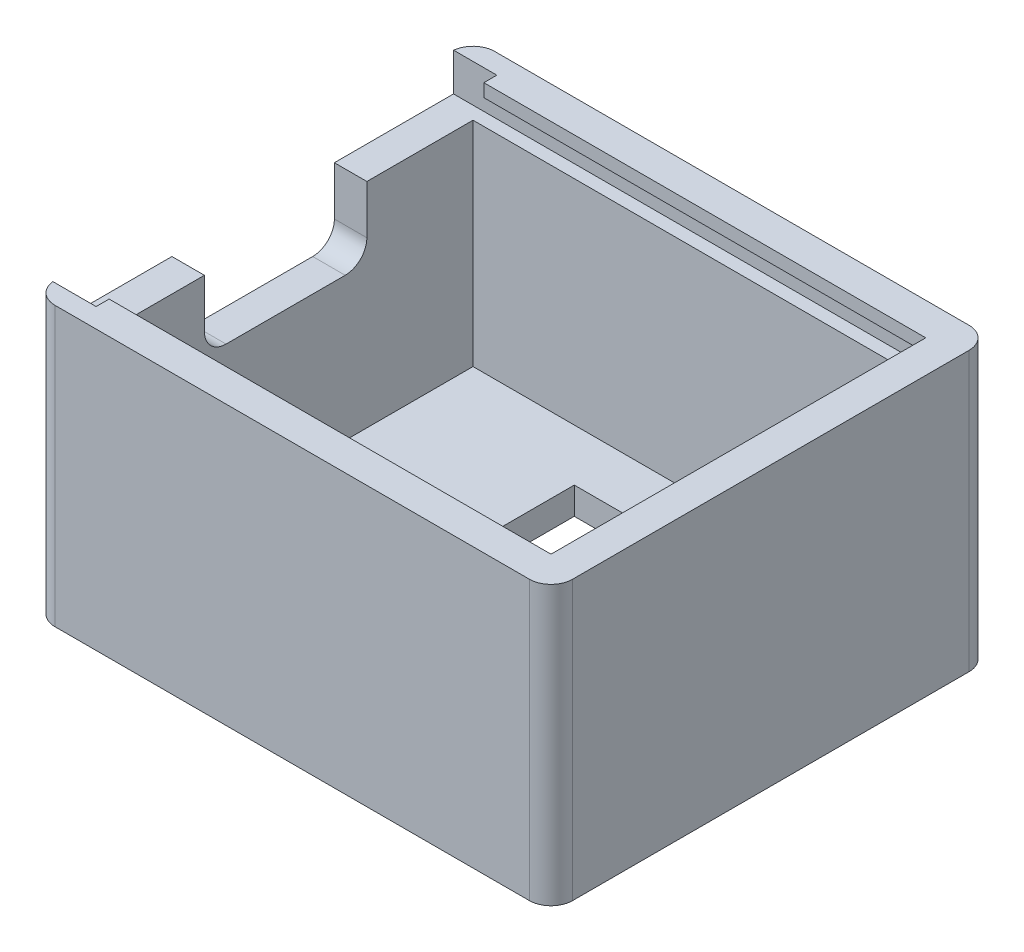
ISO-10303-21;
HEADER;
FILE_DESCRIPTION(('STEP AP214'),'2;1');
FILE_NAME('part.step','',(''),(''),'','','');
FILE_SCHEMA(('AUTOMOTIVE_DESIGN { 1 0 10303 214 1 1 1 1 }'));
ENDSEC;
DATA;
#1=APPLICATION_CONTEXT('core data for automotive mechanical design processes');
#2=APPLICATION_PROTOCOL_DEFINITION('international standard','automotive_design',2000,#1);
#3=PRODUCT_CONTEXT('',#1,'mechanical');
#4=PRODUCT('Part','Part','',(#3));
#5=PRODUCT_RELATED_PRODUCT_CATEGORY('part','',(#4));
#6=PRODUCT_DEFINITION_FORMATION('','',#4);
#7=PRODUCT_DEFINITION_CONTEXT('part definition',#1,'design');
#8=PRODUCT_DEFINITION('design','',#6,#7);
#9=PRODUCT_DEFINITION_SHAPE('','',#8);
#10=(LENGTH_UNIT() NAMED_UNIT(*) SI_UNIT(.MILLI.,.METRE.));
#11=(NAMED_UNIT(*) PLANE_ANGLE_UNIT() SI_UNIT($,.RADIAN.));
#12=(NAMED_UNIT(*) SI_UNIT($,.STERADIAN.) SOLID_ANGLE_UNIT());
#13=UNCERTAINTY_MEASURE_WITH_UNIT(LENGTH_MEASURE(1.E-05),#10,'distance_accuracy_value','');
#14=(GEOMETRIC_REPRESENTATION_CONTEXT(3) GLOBAL_UNCERTAINTY_ASSIGNED_CONTEXT((#13)) GLOBAL_UNIT_ASSIGNED_CONTEXT((#10,
#11,#12)) REPRESENTATION_CONTEXT('',''));
#15=CARTESIAN_POINT('',(0.,0.,0.));
#16=DIRECTION('',(0.,0.,1.));
#17=DIRECTION('',(1.,0.,0.));
#18=AXIS2_PLACEMENT_3D('',#15,#16,#17);
#19=CARTESIAN_POINT('',(-20.9,2.5,17.3));
#20=DIRECTION('',(0.,0.,1.));
#21=DIRECTION('',(1.,0.,0.));
#22=AXIS2_PLACEMENT_3D('',#19,#20,#21);
#23=PLANE('',#22);
#24=DIRECTION('',(0.,-1.,0.));
#25=VECTOR('',#24,1.);
#26=CARTESIAN_POINT('',(-19.9,2.5,17.3));
#27=LINE('',#26,#25);
#28=CARTESIAN_POINT('',(-19.9,25.7,17.3));
#29=VERTEX_POINT('',#28);
#30=CARTESIAN_POINT('',(-19.9,24.5,17.3));
#31=VERTEX_POINT('',#30);
#32=EDGE_CURVE('E468',#29,#31,#27,.T.);
#33=ORIENTED_EDGE('',*,*,#32,.F.);
#34=DIRECTION('',(1.,0.,0.));
#35=VECTOR('',#34,1.);
#36=CARTESIAN_POINT('',(-20.9,25.7,17.3));
#37=LINE('',#36,#35);
#38=CARTESIAN_POINT('',(20.9,25.7,17.3));
#39=VERTEX_POINT('',#38);
#40=EDGE_CURVE('E339',#29,#39,#37,.T.);
#41=ORIENTED_EDGE('',*,*,#40,.T.);
#42=DIRECTION('',(0.,1.,0.));
#43=VECTOR('',#42,1.);
#44=CARTESIAN_POINT('',(20.9,2.5,17.3));
#45=LINE('',#44,#43);
#46=CARTESIAN_POINT('',(20.9,24.5,17.3));
#47=VERTEX_POINT('',#46);
#48=EDGE_CURVE('E359',#47,#39,#45,.T.);
#49=ORIENTED_EDGE('',*,*,#48,.F.);
#50=DIRECTION('',(-1.,0.,0.));
#51=VECTOR('',#50,1.);
#52=CARTESIAN_POINT('',(-20.9,24.5,17.3));
#53=LINE('',#52,#51);
#54=EDGE_CURVE('E296',#47,#31,#53,.T.);
#55=ORIENTED_EDGE('',*,*,#54,.T.);
#56=EDGE_LOOP('',(#33,#41,#49,#55));
#57=FACE_BOUND('',#56,.T.);
#58=ADVANCED_FACE('F39',(#57),#23,.F.);
#59=CARTESIAN_POINT('',(-20.9,2.5,-17.3));
#60=DIRECTION('',(0.,0.,-1.));
#61=DIRECTION('',(-1.,0.,0.));
#62=AXIS2_PLACEMENT_3D('',#59,#60,#61);
#63=PLANE('',#62);
#64=DIRECTION('',(0.,1.,0.));
#65=VECTOR('',#64,1.);
#66=CARTESIAN_POINT('',(-19.9,2.5,-17.3));
#67=LINE('',#66,#65);
#68=CARTESIAN_POINT('',(-19.9,24.5,-17.3));
#69=VERTEX_POINT('',#68);
#70=CARTESIAN_POINT('',(-19.9,25.7,-17.3));
#71=VERTEX_POINT('',#70);
#72=EDGE_CURVE('E475',#69,#71,#67,.T.);
#73=ORIENTED_EDGE('',*,*,#72,.F.);
#74=DIRECTION('',(1.,0.,0.));
#75=VECTOR('',#74,1.);
#76=CARTESIAN_POINT('',(-20.9,24.5,-17.3));
#77=LINE('',#76,#75);
#78=CARTESIAN_POINT('',(20.9,24.5,-17.3));
#79=VERTEX_POINT('',#78);
#80=EDGE_CURVE('E294',#69,#79,#77,.T.);
#81=ORIENTED_EDGE('',*,*,#80,.T.);
#82=DIRECTION('',(0.,1.,0.));
#83=VECTOR('',#82,1.);
#84=CARTESIAN_POINT('',(20.9,2.5,-17.3));
#85=LINE('',#84,#83);
#86=CARTESIAN_POINT('',(20.9,25.7,-17.3));
#87=VERTEX_POINT('',#86);
#88=EDGE_CURVE('E348',#79,#87,#85,.T.);
#89=ORIENTED_EDGE('',*,*,#88,.T.);
#90=DIRECTION('',(-1.,0.,0.));
#91=VECTOR('',#90,1.);
#92=CARTESIAN_POINT('',(-20.9,25.7,-17.3));
#93=LINE('',#92,#91);
#94=EDGE_CURVE('E351',#87,#71,#93,.T.);
#95=ORIENTED_EDGE('',*,*,#94,.T.);
#96=EDGE_LOOP('',(#73,#81,#89,#95));
#97=FACE_BOUND('',#96,.T.);
#98=ADVANCED_FACE('F552',(#97),#63,.F.);
#99=CARTESIAN_POINT('',(0.,24.5,0.));
#100=DIRECTION('',(0.,1.,0.));
#101=DIRECTION('',(0.,0.,1.));
#102=AXIS2_PLACEMENT_3D('',#99,#100,#101);
#103=PLANE('',#102);
#104=DIRECTION('',(0.,0.,1.));
#105=VECTOR('',#104,1.);
#106=CARTESIAN_POINT('',(-19.9,24.5,0.));
#107=LINE('',#106,#105);
#108=CARTESIAN_POINT('',(-19.9,24.5,-18.5));
#109=VERTEX_POINT('',#108);
#110=EDGE_CURVE('E469',#109,#69,#107,.T.);
#111=ORIENTED_EDGE('',*,*,#110,.F.);
#112=DIRECTION('',(-1.,0.,0.));
#113=VECTOR('',#112,1.);
#114=CARTESIAN_POINT('',(-24.9,24.5,-18.5));
#115=LINE('',#114,#113);
#116=CARTESIAN_POINT('',(22.1,24.5,-18.5));
#117=VERTEX_POINT('',#116);
#118=EDGE_CURVE('E488',#117,#109,#115,.T.);
#119=ORIENTED_EDGE('',*,*,#118,.F.);
#120=DIRECTION('',(0.,0.,-1.));
#121=VECTOR('',#120,1.);
#122=CARTESIAN_POINT('',(22.1,24.5,-18.5));
#123=LINE('',#122,#121);
#124=CARTESIAN_POINT('',(22.1,24.5,18.5));
#125=VERTEX_POINT('',#124);
#126=EDGE_CURVE('E485',#125,#117,#123,.T.);
#127=ORIENTED_EDGE('',*,*,#126,.F.);
#128=DIRECTION('',(1.,0.,0.));
#129=VECTOR('',#128,1.);
#130=CARTESIAN_POINT('',(-24.9,24.5,18.5));
#131=LINE('',#130,#129);
#132=CARTESIAN_POINT('',(-19.9,24.5,18.5));
#133=VERTEX_POINT('',#132);
#134=EDGE_CURVE('E483',#133,#125,#131,.T.);
#135=ORIENTED_EDGE('',*,*,#134,.F.);
#136=EDGE_CURVE('E466',#31,#133,#107,.T.);
#137=ORIENTED_EDGE('',*,*,#136,.F.);
#138=ORIENTED_EDGE('',*,*,#54,.F.);
#139=DIRECTION('',(0.,0.,1.));
#140=VECTOR('',#139,1.);
#141=CARTESIAN_POINT('',(20.9,24.5,-17.3));
#142=LINE('',#141,#140);
#143=EDGE_CURVE('E299',#79,#47,#142,.T.);
#144=ORIENTED_EDGE('',*,*,#143,.F.);
#145=ORIENTED_EDGE('',*,*,#80,.F.);
#146=EDGE_LOOP('',(#111,#119,#127,#135,#137,#138,#144,#145));
#147=FACE_BOUND('',#146,.T.);
#148=ADVANCED_FACE('F558',(#147),#103,.F.);
#149=CARTESIAN_POINT('',(-23.9,25.7,-20.3));
#150=DIRECTION('',(1.,0.,0.));
#151=DIRECTION('',(0.,0.,-1.));
#152=AXIS2_PLACEMENT_3D('',#149,#150,#151);
#153=PLANE('',#152);
#154=DIRECTION('',(0.,0.,1.));
#155=VECTOR('',#154,1.);
#156=CARTESIAN_POINT('',(-23.9,22.2,-20.3));
#157=LINE('',#156,#155);
#158=CARTESIAN_POINT('',(-23.9,22.2,7.5));
#159=VERTEX_POINT('',#158);
#160=CARTESIAN_POINT('',(-23.9,22.2,18.3));
#161=VERTEX_POINT('',#160);
#162=EDGE_CURVE('E262',#159,#161,#157,.T.);
#163=ORIENTED_EDGE('',*,*,#162,.F.);
#164=DIRECTION('',(0.,1.,0.));
#165=VECTOR('',#164,1.);
#166=CARTESIAN_POINT('',(-23.9,28.7,7.5));
#167=LINE('',#166,#165);
#168=CARTESIAN_POINT('',(-23.9,17.7,7.5));
#169=VERTEX_POINT('',#168);
#170=EDGE_CURVE('E248',#169,#159,#167,.T.);
#171=ORIENTED_EDGE('',*,*,#170,.F.);
#172=CARTESIAN_POINT('',(-23.9,17.7,5.5));
#173=DIRECTION('',(1.,0.,0.));
#174=DIRECTION('',(0.,0.,-1.));
#175=AXIS2_PLACEMENT_3D('',#172,#173,#174);
#176=CIRCLE('',#175,2.);
#177=CARTESIAN_POINT('',(-23.9,15.7,5.5));
#178=VERTEX_POINT('',#177);
#179=EDGE_CURVE('E439',#169,#178,#176,.T.);
#180=ORIENTED_EDGE('',*,*,#179,.T.);
#181=DIRECTION('',(0.,0.,1.));
#182=VECTOR('',#181,1.);
#183=CARTESIAN_POINT('',(-23.9,15.7,-7.5));
#184=LINE('',#183,#182);
#185=CARTESIAN_POINT('',(-23.9,15.7,-5.5));
#186=VERTEX_POINT('',#185);
#187=EDGE_CURVE('E454',#186,#178,#184,.T.);
#188=ORIENTED_EDGE('',*,*,#187,.F.);
#189=CARTESIAN_POINT('',(-23.9,17.7,-5.5));
#190=DIRECTION('',(1.,0.,0.));
#191=DIRECTION('',(0.,0.,-1.));
#192=AXIS2_PLACEMENT_3D('',#189,#190,#191);
#193=CIRCLE('',#192,2.);
#194=CARTESIAN_POINT('',(-23.9,17.7,-7.5));
#195=VERTEX_POINT('',#194);
#196=EDGE_CURVE('E47',#186,#195,#193,.T.);
#197=ORIENTED_EDGE('',*,*,#196,.T.);
#198=DIRECTION('',(0.,-1.,0.));
#199=VECTOR('',#198,1.);
#200=CARTESIAN_POINT('',(-23.9,28.7,-7.5));
#201=LINE('',#200,#199);
#202=CARTESIAN_POINT('',(-23.9,22.2,-7.5));
#203=VERTEX_POINT('',#202);
#204=EDGE_CURVE('E257',#203,#195,#201,.T.);
#205=ORIENTED_EDGE('',*,*,#204,.F.);
#206=CARTESIAN_POINT('',(-23.9,22.2,-18.3));
#207=VERTEX_POINT('',#206);
#208=EDGE_CURVE('E274',#207,#203,#157,.T.);
#209=ORIENTED_EDGE('',*,*,#208,.F.);
#210=DIRECTION('',(0.,-1.,0.));
#211=VECTOR('',#210,1.);
#212=CARTESIAN_POINT('',(-23.9,25.7,-18.3));
#213=LINE('',#212,#211);
#214=CARTESIAN_POINT('',(-23.9,0.,-18.3));
#215=VERTEX_POINT('',#214);
#216=EDGE_CURVE('E416',#207,#215,#213,.T.);
#217=ORIENTED_EDGE('',*,*,#216,.T.);
#218=DIRECTION('',(0.,0.,1.));
#219=VECTOR('',#218,1.);
#220=CARTESIAN_POINT('',(-23.9,0.,-20.3));
#221=LINE('',#220,#219);
#222=CARTESIAN_POINT('',(-23.9,0.,18.3));
#223=VERTEX_POINT('',#222);
#224=EDGE_CURVE('E385',#215,#223,#221,.T.);
#225=ORIENTED_EDGE('',*,*,#224,.T.);
#226=DIRECTION('',(0.,-1.,0.));
#227=VECTOR('',#226,1.);
#228=CARTESIAN_POINT('',(-23.9,25.7,18.3));
#229=LINE('',#228,#227);
#230=EDGE_CURVE('E273',#223,#161,#229,.F.);
#231=ORIENTED_EDGE('',*,*,#230,.T.);
#232=EDGE_LOOP('',(#163,#171,#180,#188,#197,#205,#209,#217,#225,#231));
#233=FACE_BOUND('',#232,.T.);
#234=ADVANCED_FACE('F270',(#233),#153,.F.);
#235=CARTESIAN_POINT('',(20.9,2.5,-17.3));
#236=DIRECTION('',(1.,0.,0.));
#237=DIRECTION('',(0.,0.,-1.));
#238=AXIS2_PLACEMENT_3D('',#235,#236,#237);
#239=PLANE('',#238);
#240=DIRECTION('',(0.,0.,1.));
#241=VECTOR('',#240,1.);
#242=CARTESIAN_POINT('',(20.9,22.2,-17.3));
#243=LINE('',#242,#241);
#244=CARTESIAN_POINT('',(20.9,22.2,-17.3));
#245=VERTEX_POINT('',#244);
#246=CARTESIAN_POINT('',(20.9,22.2,17.3));
#247=VERTEX_POINT('',#246);
#248=EDGE_CURVE('E292',#245,#247,#243,.T.);
#249=ORIENTED_EDGE('',*,*,#248,.F.);
#250=CARTESIAN_POINT('',(20.9,2.5,-17.3));
#251=VERTEX_POINT('',#250);
#252=EDGE_CURVE('E366',#251,#245,#85,.T.);
#253=ORIENTED_EDGE('',*,*,#252,.F.);
#254=DIRECTION('',(0.,0.,-1.));
#255=VECTOR('',#254,1.);
#256=CARTESIAN_POINT('',(20.9,2.5,-17.3));
#257=LINE('',#256,#255);
#258=CARTESIAN_POINT('',(20.9,2.5,17.3));
#259=VERTEX_POINT('',#258);
#260=EDGE_CURVE('E335',#259,#251,#257,.T.);
#261=ORIENTED_EDGE('',*,*,#260,.F.);
#262=EDGE_CURVE('E355',#259,#247,#45,.T.);
#263=ORIENTED_EDGE('',*,*,#262,.T.);
#264=EDGE_LOOP('',(#249,#253,#261,#263));
#265=FACE_BOUND('',#264,.T.);
#266=ADVANCED_FACE('F525',(#265),#239,.F.);
#267=DIRECTION('',(-1.,0.,0.));
#268=VECTOR('',#267,1.);
#269=CARTESIAN_POINT('',(-20.9,22.2,17.3));
#270=LINE('',#269,#268);
#271=CARTESIAN_POINT('',(-20.9,22.2,17.3));
#272=VERTEX_POINT('',#271);
#273=EDGE_CURVE('E290',#247,#272,#270,.T.);
#274=ORIENTED_EDGE('',*,*,#273,.F.);
#275=ORIENTED_EDGE('',*,*,#262,.F.);
#276=DIRECTION('',(1.,0.,0.));
#277=VECTOR('',#276,1.);
#278=CARTESIAN_POINT('',(-20.9,2.5,17.3));
#279=LINE('',#278,#277);
#280=CARTESIAN_POINT('',(-20.9,2.5,17.3));
#281=VERTEX_POINT('',#280);
#282=EDGE_CURVE('E345',#281,#259,#279,.T.);
#283=ORIENTED_EDGE('',*,*,#282,.F.);
#284=DIRECTION('',(0.,1.,0.));
#285=VECTOR('',#284,1.);
#286=CARTESIAN_POINT('',(-20.9,2.5,17.3));
#287=LINE('',#286,#285);
#288=EDGE_CURVE('E360',#281,#272,#287,.T.);
#289=ORIENTED_EDGE('',*,*,#288,.T.);
#290=EDGE_LOOP('',(#274,#275,#283,#289));
#291=FACE_BOUND('',#290,.T.);
#292=ADVANCED_FACE('F529',(#291),#23,.F.);
#293=CARTESIAN_POINT('',(-20.9,2.5,-17.3));
#294=DIRECTION('',(-1.,0.,0.));
#295=DIRECTION('',(0.,0.,1.));
#296=AXIS2_PLACEMENT_3D('',#293,#294,#295);
#297=PLANE('',#296);
#298=DIRECTION('',(0.,-1.,0.));
#299=VECTOR('',#298,1.);
#300=CARTESIAN_POINT('',(-20.9,2.5,-7.5));
#301=LINE('',#300,#299);
#302=CARTESIAN_POINT('',(-20.9,22.2,-7.5));
#303=VERTEX_POINT('',#302);
#304=CARTESIAN_POINT('',(-20.9,17.7,-7.5));
#305=VERTEX_POINT('',#304);
#306=EDGE_CURVE('E450',#303,#305,#301,.T.);
#307=ORIENTED_EDGE('',*,*,#306,.T.);
#308=CARTESIAN_POINT('',(-20.9,17.7,-5.5));
#309=DIRECTION('',(-1.,0.,0.));
#310=DIRECTION('',(0.,0.,1.));
#311=AXIS2_PLACEMENT_3D('',#308,#309,#310);
#312=CIRCLE('',#311,2.);
#313=CARTESIAN_POINT('',(-20.9,15.7,-5.5));
#314=VERTEX_POINT('',#313);
#315=EDGE_CURVE('E11',#305,#314,#312,.T.);
#316=ORIENTED_EDGE('',*,*,#315,.T.);
#317=DIRECTION('',(0.,0.,1.));
#318=VECTOR('',#317,1.);
#319=CARTESIAN_POINT('',(-20.9,15.7,-17.3));
#320=LINE('',#319,#318);
#321=CARTESIAN_POINT('',(-20.9,15.7,5.5));
#322=VERTEX_POINT('',#321);
#323=EDGE_CURVE('E266',#314,#322,#320,.T.);
#324=ORIENTED_EDGE('',*,*,#323,.T.);
#325=CARTESIAN_POINT('',(-20.9,17.7,5.5));
#326=DIRECTION('',(-1.,0.,0.));
#327=DIRECTION('',(0.,0.,1.));
#328=AXIS2_PLACEMENT_3D('',#325,#326,#327);
#329=CIRCLE('',#328,2.);
#330=CARTESIAN_POINT('',(-20.9,17.7,7.5));
#331=VERTEX_POINT('',#330);
#332=EDGE_CURVE('E441',#322,#331,#329,.T.);
#333=ORIENTED_EDGE('',*,*,#332,.T.);
#334=DIRECTION('',(0.,1.,0.));
#335=VECTOR('',#334,1.);
#336=CARTESIAN_POINT('',(-20.9,2.50000000000001,7.5));
#337=LINE('',#336,#335);
#338=CARTESIAN_POINT('',(-20.9,22.2,7.5));
#339=VERTEX_POINT('',#338);
#340=EDGE_CURVE('E445',#331,#339,#337,.T.);
#341=ORIENTED_EDGE('',*,*,#340,.T.);
#342=DIRECTION('',(0.,0.,-1.));
#343=VECTOR('',#342,1.);
#344=CARTESIAN_POINT('',(-20.9,22.2,-17.3));
#345=LINE('',#344,#343);
#346=EDGE_CURVE('E265',#272,#339,#345,.T.);
#347=ORIENTED_EDGE('',*,*,#346,.F.);
#348=ORIENTED_EDGE('',*,*,#288,.F.);
#349=DIRECTION('',(0.,0.,1.));
#350=VECTOR('',#349,1.);
#351=CARTESIAN_POINT('',(-20.9,2.5,-17.3));
#352=LINE('',#351,#350);
#353=CARTESIAN_POINT('',(-20.9,2.5,-17.3));
#354=VERTEX_POINT('',#353);
#355=EDGE_CURVE('E342',#354,#281,#352,.T.);
#356=ORIENTED_EDGE('',*,*,#355,.F.);
#357=DIRECTION('',(0.,1.,0.));
#358=VECTOR('',#357,1.);
#359=CARTESIAN_POINT('',(-20.9,2.5,-17.3));
#360=LINE('',#359,#358);
#361=CARTESIAN_POINT('',(-20.9,22.2,-17.3));
#362=VERTEX_POINT('',#361);
#363=EDGE_CURVE('E363',#354,#362,#360,.T.);
#364=ORIENTED_EDGE('',*,*,#363,.T.);
#365=EDGE_CURVE('E288',#303,#362,#345,.T.);
#366=ORIENTED_EDGE('',*,*,#365,.F.);
#367=EDGE_LOOP('',(#307,#316,#324,#333,#341,#347,#348,#356,#364,#366));
#368=FACE_BOUND('',#367,.T.);
#369=ADVANCED_FACE('F444',(#368),#297,.F.);
#370=DIRECTION('',(1.,0.,0.));
#371=VECTOR('',#370,1.);
#372=CARTESIAN_POINT('',(-20.9,22.2,-17.3));
#373=LINE('',#372,#371);
#374=EDGE_CURVE('E286',#362,#245,#373,.T.);
#375=ORIENTED_EDGE('',*,*,#374,.F.);
#376=ORIENTED_EDGE('',*,*,#363,.F.);
#377=DIRECTION('',(-1.,0.,0.));
#378=VECTOR('',#377,1.);
#379=CARTESIAN_POINT('',(-20.9,2.5,-17.3));
#380=LINE('',#379,#378);
#381=EDGE_CURVE('E338',#251,#354,#380,.T.);
#382=ORIENTED_EDGE('',*,*,#381,.F.);
#383=ORIENTED_EDGE('',*,*,#252,.T.);
#384=EDGE_LOOP('',(#375,#376,#382,#383));
#385=FACE_BOUND('',#384,.T.);
#386=ADVANCED_FACE('F521',(#385),#63,.F.);
#387=CARTESIAN_POINT('',(23.9,25.7,-20.3));
#388=DIRECTION('',(-1.,0.,0.));
#389=DIRECTION('',(0.,0.,1.));
#390=AXIS2_PLACEMENT_3D('',#387,#388,#389);
#391=PLANE('',#390);
#392=DIRECTION('',(0.,0.,-1.));
#393=VECTOR('',#392,1.);
#394=CARTESIAN_POINT('',(23.9,0.,-20.3));
#395=LINE('',#394,#393);
#396=CARTESIAN_POINT('',(23.9,0.,18.3));
#397=VERTEX_POINT('',#396);
#398=CARTESIAN_POINT('',(23.9,0.,-18.3));
#399=VERTEX_POINT('',#398);
#400=EDGE_CURVE('E358',#397,#399,#395,.T.);
#401=ORIENTED_EDGE('',*,*,#400,.T.);
#402=DIRECTION('',(0.,-1.,0.));
#403=VECTOR('',#402,1.);
#404=CARTESIAN_POINT('',(23.9,25.7,-18.3));
#405=LINE('',#404,#403);
#406=CARTESIAN_POINT('',(23.9,25.7,-18.3));
#407=VERTEX_POINT('',#406);
#408=EDGE_CURVE('E404',#399,#407,#405,.F.);
#409=ORIENTED_EDGE('',*,*,#408,.T.);
#410=DIRECTION('',(0.,0.,-1.));
#411=VECTOR('',#410,1.);
#412=CARTESIAN_POINT('',(23.9,25.7,-20.3));
#413=LINE('',#412,#411);
#414=CARTESIAN_POINT('',(23.9,25.7,18.3));
#415=VERTEX_POINT('',#414);
#416=EDGE_CURVE('E369',#415,#407,#413,.T.);
#417=ORIENTED_EDGE('',*,*,#416,.F.);
#418=DIRECTION('',(0.,-1.,0.));
#419=VECTOR('',#418,1.);
#420=CARTESIAN_POINT('',(23.9,25.7,18.3));
#421=LINE('',#420,#419);
#422=EDGE_CURVE('E401',#415,#397,#421,.T.);
#423=ORIENTED_EDGE('',*,*,#422,.T.);
#424=EDGE_LOOP('',(#401,#409,#417,#423));
#425=FACE_BOUND('',#424,.T.);
#426=ADVANCED_FACE('F588',(#425),#391,.F.);
#427=CARTESIAN_POINT('',(-23.9,25.7,-20.3));
#428=DIRECTION('',(0.,0.,1.));
#429=DIRECTION('',(1.,0.,0.));
#430=AXIS2_PLACEMENT_3D('',#427,#428,#429);
#431=PLANE('',#430);
#432=DIRECTION('',(-1.,0.,0.));
#433=VECTOR('',#432,1.);
#434=CARTESIAN_POINT('',(-23.9,25.7,-20.3));
#435=LINE('',#434,#433);
#436=CARTESIAN_POINT('',(21.9,25.7,-20.3));
#437=VERTEX_POINT('',#436);
#438=CARTESIAN_POINT('',(-21.9,25.7,-20.3));
#439=VERTEX_POINT('',#438);
#440=EDGE_CURVE('E372',#437,#439,#435,.T.);
#441=ORIENTED_EDGE('',*,*,#440,.F.);
#442=DIRECTION('',(0.,-1.,0.));
#443=VECTOR('',#442,1.);
#444=CARTESIAN_POINT('',(21.9,25.7,-20.3));
#445=LINE('',#444,#443);
#446=CARTESIAN_POINT('',(21.9,0.,-20.3));
#447=VERTEX_POINT('',#446);
#448=EDGE_CURVE('E390',#437,#447,#445,.T.);
#449=ORIENTED_EDGE('',*,*,#448,.T.);
#450=DIRECTION('',(-1.,0.,0.));
#451=VECTOR('',#450,1.);
#452=CARTESIAN_POINT('',(-23.9,0.,-20.3));
#453=LINE('',#452,#451);
#454=CARTESIAN_POINT('',(-21.9,0.,-20.3));
#455=VERTEX_POINT('',#454);
#456=EDGE_CURVE('E382',#447,#455,#453,.T.);
#457=ORIENTED_EDGE('',*,*,#456,.T.);
#458=DIRECTION('',(0.,-1.,0.));
#459=VECTOR('',#458,1.);
#460=CARTESIAN_POINT('',(-21.9,25.7,-20.3));
#461=LINE('',#460,#459);
#462=EDGE_CURVE('E379',#455,#439,#461,.F.);
#463=ORIENTED_EDGE('',*,*,#462,.T.);
#464=EDGE_LOOP('',(#441,#449,#457,#463));
#465=FACE_BOUND('',#464,.T.);
#466=ADVANCED_FACE('F583',(#465),#431,.F.);
#467=CARTESIAN_POINT('',(-23.9,25.7,20.3));
#468=DIRECTION('',(0.,0.,-1.));
#469=DIRECTION('',(-1.,0.,0.));
#470=AXIS2_PLACEMENT_3D('',#467,#468,#469);
#471=PLANE('',#470);
#472=DIRECTION('',(1.,0.,0.));
#473=VECTOR('',#472,1.);
#474=CARTESIAN_POINT('',(-23.9,25.7,20.3));
#475=LINE('',#474,#473);
#476=CARTESIAN_POINT('',(-21.9,25.7,20.3));
#477=VERTEX_POINT('',#476);
#478=CARTESIAN_POINT('',(21.9,25.7,20.3));
#479=VERTEX_POINT('',#478);
#480=EDGE_CURVE('E376',#477,#479,#475,.T.);
#481=ORIENTED_EDGE('',*,*,#480,.F.);
#482=DIRECTION('',(0.,-1.,0.));
#483=VECTOR('',#482,1.);
#484=CARTESIAN_POINT('',(-21.9,25.7,20.3));
#485=LINE('',#484,#483);
#486=CARTESIAN_POINT('',(-21.9,0.,20.3));
#487=VERTEX_POINT('',#486);
#488=EDGE_CURVE('E420',#477,#487,#485,.T.);
#489=ORIENTED_EDGE('',*,*,#488,.T.);
#490=DIRECTION('',(1.,0.,0.));
#491=VECTOR('',#490,1.);
#492=CARTESIAN_POINT('',(-23.9,0.,20.3));
#493=LINE('',#492,#491);
#494=CARTESIAN_POINT('',(21.9,0.,20.3));
#495=VERTEX_POINT('',#494);
#496=EDGE_CURVE('E373',#487,#495,#493,.T.);
#497=ORIENTED_EDGE('',*,*,#496,.T.);
#498=DIRECTION('',(0.,-1.,0.));
#499=VECTOR('',#498,1.);
#500=CARTESIAN_POINT('',(21.9,25.7,20.3));
#501=LINE('',#500,#499);
#502=EDGE_CURVE('E418',#495,#479,#501,.F.);
#503=ORIENTED_EDGE('',*,*,#502,.T.);
#504=EDGE_LOOP('',(#481,#489,#497,#503));
#505=FACE_BOUND('',#504,.T.);
#506=ADVANCED_FACE('F578',(#505),#471,.F.);
#507=CARTESIAN_POINT('',(0.,25.7,0.));
#508=DIRECTION('',(0.,1.,0.));
#509=DIRECTION('',(0.,0.,1.));
#510=AXIS2_PLACEMENT_3D('',#507,#508,#509);
#511=PLANE('',#510);
#512=DIRECTION('',(-1.,0.,0.));
#513=VECTOR('',#512,1.);
#514=CARTESIAN_POINT('',(0.,25.7,-18.5));
#515=LINE('',#514,#513);
#516=CARTESIAN_POINT('',(-19.9,25.7,-18.5));
#517=VERTEX_POINT('',#516);
#518=CARTESIAN_POINT('',(-23.8899748742132,25.7,-18.5));
#519=VERTEX_POINT('',#518);
#520=EDGE_CURVE('E477',#517,#519,#515,.T.);
#521=ORIENTED_EDGE('',*,*,#520,.F.);
#522=DIRECTION('',(0.,0.,1.));
#523=VECTOR('',#522,1.);
#524=CARTESIAN_POINT('',(-19.9,25.7,0.));
#525=LINE('',#524,#523);
#526=EDGE_CURVE('E474',#517,#71,#525,.T.);
#527=ORIENTED_EDGE('',*,*,#526,.T.);
#528=ORIENTED_EDGE('',*,*,#94,.F.);
#529=DIRECTION('',(0.,0.,-1.));
#530=VECTOR('',#529,1.);
#531=CARTESIAN_POINT('',(20.9,25.7,-17.3));
#532=LINE('',#531,#530);
#533=EDGE_CURVE('E328',#39,#87,#532,.T.);
#534=ORIENTED_EDGE('',*,*,#533,.F.);
#535=ORIENTED_EDGE('',*,*,#40,.F.);
#536=CARTESIAN_POINT('',(-19.9,25.7,18.5));
#537=VERTEX_POINT('',#536);
#538=EDGE_CURVE('E471',#29,#537,#525,.T.);
#539=ORIENTED_EDGE('',*,*,#538,.T.);
#540=DIRECTION('',(1.,0.,0.));
#541=VECTOR('',#540,1.);
#542=CARTESIAN_POINT('',(0.,25.7,18.5));
#543=LINE('',#542,#541);
#544=CARTESIAN_POINT('',(-23.8899748742132,25.7,18.5));
#545=VERTEX_POINT('',#544);
#546=EDGE_CURVE('E480',#545,#537,#543,.T.);
#547=ORIENTED_EDGE('',*,*,#546,.F.);
#548=CARTESIAN_POINT('',(-21.9,25.7,18.3));
#549=DIRECTION('',(0.,1.,0.));
#550=DIRECTION('',(0.,0.,1.));
#551=AXIS2_PLACEMENT_3D('',#548,#549,#550);
#552=CIRCLE('',#551,2.);
#553=EDGE_CURVE('E408',#545,#477,#552,.T.);
#554=ORIENTED_EDGE('',*,*,#553,.T.);
#555=ORIENTED_EDGE('',*,*,#480,.T.);
#556=CARTESIAN_POINT('',(21.9,25.7,18.3));
#557=DIRECTION('',(0.,1.,0.));
#558=DIRECTION('',(0.,0.,1.));
#559=AXIS2_PLACEMENT_3D('',#556,#557,#558);
#560=CIRCLE('',#559,2.);
#561=EDGE_CURVE('E406',#479,#415,#560,.T.);
#562=ORIENTED_EDGE('',*,*,#561,.T.);
#563=ORIENTED_EDGE('',*,*,#416,.T.);
#564=CARTESIAN_POINT('',(21.9,25.7,-18.3));
#565=DIRECTION('',(0.,1.,0.));
#566=DIRECTION('',(0.,0.,1.));
#567=AXIS2_PLACEMENT_3D('',#564,#565,#566);
#568=CIRCLE('',#567,2.);
#569=EDGE_CURVE('E413',#407,#437,#568,.T.);
#570=ORIENTED_EDGE('',*,*,#569,.T.);
#571=ORIENTED_EDGE('',*,*,#440,.T.);
#572=CARTESIAN_POINT('',(-21.9,25.7,-18.3));
#573=DIRECTION('',(0.,1.,0.));
#574=DIRECTION('',(0.,0.,1.));
#575=AXIS2_PLACEMENT_3D('',#572,#573,#574);
#576=CIRCLE('',#575,2.);
#577=EDGE_CURVE('E410',#439,#519,#576,.T.);
#578=ORIENTED_EDGE('',*,*,#577,.T.);
#579=EDGE_LOOP('',(#521,#527,#528,#534,#535,#539,#547,#554,#555,#562,#563,#570,#571,#578));
#580=FACE_BOUND('',#579,.T.);
#581=ADVANCED_FACE('F575',(#580),#511,.T.);
#582=CARTESIAN_POINT('',(0.,0.,0.));
#583=DIRECTION('',(0.,1.,0.));
#584=DIRECTION('',(0.,0.,1.));
#585=AXIS2_PLACEMENT_3D('',#582,#583,#584);
#586=PLANE('',#585);
#587=DIRECTION('',(1.,0.,0.));
#588=VECTOR('',#587,1.);
#589=CARTESIAN_POINT('',(-6.75,0.,12.5));
#590=LINE('',#589,#588);
#591=CARTESIAN_POINT('',(-6.75,0.,12.5));
#592=VERTEX_POINT('',#591);
#593=CARTESIAN_POINT('',(18.25,0.,12.5));
#594=VERTEX_POINT('',#593);
#595=EDGE_CURVE('E313',#592,#594,#590,.T.);
#596=ORIENTED_EDGE('',*,*,#595,.T.);
#597=DIRECTION('',(0.,0.,-1.));
#598=VECTOR('',#597,1.);
#599=CARTESIAN_POINT('',(18.25,0.,-12.5));
#600=LINE('',#599,#598);
#601=CARTESIAN_POINT('',(18.25,0.,-12.5));
#602=VERTEX_POINT('',#601);
#603=EDGE_CURVE('E303',#594,#602,#600,.T.);
#604=ORIENTED_EDGE('',*,*,#603,.T.);
#605=DIRECTION('',(-1.,0.,0.));
#606=VECTOR('',#605,1.);
#607=CARTESIAN_POINT('',(-6.75,0.,-12.5));
#608=LINE('',#607,#606);
#609=CARTESIAN_POINT('',(-6.75,0.,-12.5));
#610=VERTEX_POINT('',#609);
#611=EDGE_CURVE('E306',#602,#610,#608,.T.);
#612=ORIENTED_EDGE('',*,*,#611,.T.);
#613=DIRECTION('',(0.,0.,1.));
#614=VECTOR('',#613,1.);
#615=CARTESIAN_POINT('',(-6.75,0.,-12.5));
#616=LINE('',#615,#614);
#617=EDGE_CURVE('E310',#610,#592,#616,.T.);
#618=ORIENTED_EDGE('',*,*,#617,.T.);
#619=EDGE_LOOP('',(#596,#604,#612,#618));
#620=FACE_BOUND('',#619,.T.);
#621=ORIENTED_EDGE('',*,*,#456,.F.);
#622=CARTESIAN_POINT('',(21.9,0.,-18.3));
#623=DIRECTION('',(0.,1.,0.));
#624=DIRECTION('',(0.,0.,1.));
#625=AXIS2_PLACEMENT_3D('',#622,#623,#624);
#626=CIRCLE('',#625,2.);
#627=EDGE_CURVE('E399',#447,#399,#626,.F.);
#628=ORIENTED_EDGE('',*,*,#627,.T.);
#629=ORIENTED_EDGE('',*,*,#400,.F.);
#630=CARTESIAN_POINT('',(21.9,0.,18.3));
#631=DIRECTION('',(0.,1.,0.));
#632=DIRECTION('',(0.,0.,1.));
#633=AXIS2_PLACEMENT_3D('',#630,#631,#632);
#634=CIRCLE('',#633,2.);
#635=EDGE_CURVE('E393',#397,#495,#634,.F.);
#636=ORIENTED_EDGE('',*,*,#635,.T.);
#637=ORIENTED_EDGE('',*,*,#496,.F.);
#638=CARTESIAN_POINT('',(-21.9,0.,18.3));
#639=DIRECTION('',(0.,1.,0.));
#640=DIRECTION('',(0.,0.,1.));
#641=AXIS2_PLACEMENT_3D('',#638,#639,#640);
#642=CIRCLE('',#641,2.);
#643=EDGE_CURVE('E395',#487,#223,#642,.F.);
#644=ORIENTED_EDGE('',*,*,#643,.T.);
#645=ORIENTED_EDGE('',*,*,#224,.F.);
#646=CARTESIAN_POINT('',(-21.9,0.,-18.3));
#647=DIRECTION('',(0.,1.,0.));
#648=DIRECTION('',(0.,0.,1.));
#649=AXIS2_PLACEMENT_3D('',#646,#647,#648);
#650=CIRCLE('',#649,2.);
#651=EDGE_CURVE('E397',#215,#455,#650,.F.);
#652=ORIENTED_EDGE('',*,*,#651,.T.);
#653=EDGE_LOOP('',(#621,#628,#629,#636,#637,#644,#645,#652));
#654=FACE_BOUND('',#653,.T.);
#655=ADVANCED_FACE('F545',(#620,#654),#586,.F.);
#656=ORIENTED_EDGE('',*,*,#88,.F.);
#657=ORIENTED_EDGE('',*,*,#143,.T.);
#658=ORIENTED_EDGE('',*,*,#48,.T.);
#659=ORIENTED_EDGE('',*,*,#533,.T.);
#660=EDGE_LOOP('',(#656,#657,#658,#659));
#661=FACE_BOUND('',#660,.T.);
#662=ADVANCED_FACE('F534',(#661),#239,.F.);
#663=CARTESIAN_POINT('',(0.,2.5,0.));
#664=DIRECTION('',(0.,1.,0.));
#665=DIRECTION('',(0.,0.,1.));
#666=AXIS2_PLACEMENT_3D('',#663,#664,#665);
#667=PLANE('',#666);
#668=DIRECTION('',(0.,0.,-1.));
#669=VECTOR('',#668,1.);
#670=CARTESIAN_POINT('',(18.25,2.5,-12.5));
#671=LINE('',#670,#669);
#672=CARTESIAN_POINT('',(18.25,2.5,12.5));
#673=VERTEX_POINT('',#672);
#674=CARTESIAN_POINT('',(18.25,2.5,-12.5));
#675=VERTEX_POINT('',#674);
#676=EDGE_CURVE('E302',#673,#675,#671,.T.);
#677=ORIENTED_EDGE('',*,*,#676,.F.);
#678=DIRECTION('',(1.,0.,0.));
#679=VECTOR('',#678,1.);
#680=CARTESIAN_POINT('',(-6.75,2.5,12.5));
#681=LINE('',#680,#679);
#682=CARTESIAN_POINT('',(-6.75,2.5,12.5));
#683=VERTEX_POINT('',#682);
#684=EDGE_CURVE('E307',#683,#673,#681,.T.);
#685=ORIENTED_EDGE('',*,*,#684,.F.);
#686=DIRECTION('',(0.,0.,1.));
#687=VECTOR('',#686,1.);
#688=CARTESIAN_POINT('',(-6.75,2.5,-12.5));
#689=LINE('',#688,#687);
#690=CARTESIAN_POINT('',(-6.75,2.5,-12.5));
#691=VERTEX_POINT('',#690);
#692=EDGE_CURVE('E322',#691,#683,#689,.T.);
#693=ORIENTED_EDGE('',*,*,#692,.F.);
#694=DIRECTION('',(-1.,0.,0.));
#695=VECTOR('',#694,1.);
#696=CARTESIAN_POINT('',(-6.75,2.5,-12.5));
#697=LINE('',#696,#695);
#698=EDGE_CURVE('E319',#675,#691,#697,.T.);
#699=ORIENTED_EDGE('',*,*,#698,.F.);
#700=EDGE_LOOP('',(#677,#685,#693,#699));
#701=FACE_BOUND('',#700,.T.);
#702=ORIENTED_EDGE('',*,*,#260,.T.);
#703=ORIENTED_EDGE('',*,*,#381,.T.);
#704=ORIENTED_EDGE('',*,*,#355,.T.);
#705=ORIENTED_EDGE('',*,*,#282,.T.);
#706=EDGE_LOOP('',(#702,#703,#704,#705));
#707=FACE_BOUND('',#706,.T.);
#708=ADVANCED_FACE('F531',(#701,#707),#667,.T.);
#709=CARTESIAN_POINT('',(21.9,25.7,-18.3));
#710=DIRECTION('',(0.,-1.,0.));
#711=DIRECTION('',(0.,0.,-1.));
#712=AXIS2_PLACEMENT_3D('',#709,#710,#711);
#713=CYLINDRICAL_SURFACE('',#712,2.);
#714=ORIENTED_EDGE('',*,*,#569,.F.);
#715=ORIENTED_EDGE('',*,*,#408,.F.);
#716=ORIENTED_EDGE('',*,*,#627,.F.);
#717=ORIENTED_EDGE('',*,*,#448,.F.);
#718=EDGE_LOOP('',(#714,#715,#716,#717));
#719=FACE_BOUND('',#718,.T.);
#720=ADVANCED_FACE('F533',(#719),#713,.T.);
#721=CARTESIAN_POINT('',(-21.9,25.7,-18.3));
#722=DIRECTION('',(0.,-1.,0.));
#723=DIRECTION('',(0.,0.,-1.));
#724=AXIS2_PLACEMENT_3D('',#721,#722,#723);
#725=CYLINDRICAL_SURFACE('',#724,2.);
#726=DIRECTION('',(0.,-1.,0.));
#727=VECTOR('',#726,1.);
#728=CARTESIAN_POINT('',(-23.8899748742132,25.7,-18.5));
#729=LINE('',#728,#727);
#730=CARTESIAN_POINT('',(-23.8899748742132,22.2,-18.5));
#731=VERTEX_POINT('',#730);
#732=EDGE_CURVE('E427',#731,#519,#729,.F.);
#733=ORIENTED_EDGE('',*,*,#732,.T.);
#734=ORIENTED_EDGE('',*,*,#577,.F.);
#735=ORIENTED_EDGE('',*,*,#462,.F.);
#736=ORIENTED_EDGE('',*,*,#651,.F.);
#737=ORIENTED_EDGE('',*,*,#216,.F.);
#738=CARTESIAN_POINT('',(-21.9,22.2,-18.3));
#739=DIRECTION('',(0.,1.,0.));
#740=DIRECTION('',(0.,0.,1.));
#741=AXIS2_PLACEMENT_3D('',#738,#739,#740);
#742=CIRCLE('',#741,2.);
#743=EDGE_CURVE('E278',#207,#731,#742,.F.);
#744=ORIENTED_EDGE('',*,*,#743,.T.);
#745=EDGE_LOOP('',(#733,#734,#735,#736,#737,#744));
#746=FACE_BOUND('',#745,.T.);
#747=ADVANCED_FACE('F509',(#746),#725,.T.);
#748=CARTESIAN_POINT('',(-21.9,25.7,18.3));
#749=DIRECTION('',(0.,-1.,0.));
#750=DIRECTION('',(0.,0.,-1.));
#751=AXIS2_PLACEMENT_3D('',#748,#749,#750);
#752=CYLINDRICAL_SURFACE('',#751,2.);
#753=ORIENTED_EDGE('',*,*,#553,.F.);
#754=DIRECTION('',(0.,-1.,0.));
#755=VECTOR('',#754,1.);
#756=CARTESIAN_POINT('',(-23.8899748742132,25.7,18.5));
#757=LINE('',#756,#755);
#758=CARTESIAN_POINT('',(-23.8899748742132,22.2,18.5));
#759=VERTEX_POINT('',#758);
#760=EDGE_CURVE('E425',#545,#759,#757,.T.);
#761=ORIENTED_EDGE('',*,*,#760,.T.);
#762=CARTESIAN_POINT('',(-21.9,22.2,18.3));
#763=DIRECTION('',(0.,1.,0.));
#764=DIRECTION('',(0.,0.,1.));
#765=AXIS2_PLACEMENT_3D('',#762,#763,#764);
#766=CIRCLE('',#765,2.);
#767=EDGE_CURVE('E423',#759,#161,#766,.F.);
#768=ORIENTED_EDGE('',*,*,#767,.T.);
#769=ORIENTED_EDGE('',*,*,#230,.F.);
#770=ORIENTED_EDGE('',*,*,#643,.F.);
#771=ORIENTED_EDGE('',*,*,#488,.F.);
#772=EDGE_LOOP('',(#753,#761,#768,#769,#770,#771));
#773=FACE_BOUND('',#772,.T.);
#774=ADVANCED_FACE('F595',(#773),#752,.T.);
#775=CARTESIAN_POINT('',(21.9,25.7,18.3));
#776=DIRECTION('',(0.,-1.,0.));
#777=DIRECTION('',(0.,0.,-1.));
#778=AXIS2_PLACEMENT_3D('',#775,#776,#777);
#779=CYLINDRICAL_SURFACE('',#778,2.);
#780=ORIENTED_EDGE('',*,*,#561,.F.);
#781=ORIENTED_EDGE('',*,*,#502,.F.);
#782=ORIENTED_EDGE('',*,*,#635,.F.);
#783=ORIENTED_EDGE('',*,*,#422,.F.);
#784=EDGE_LOOP('',(#780,#781,#782,#783));
#785=FACE_BOUND('',#784,.T.);
#786=ADVANCED_FACE('F598',(#785),#779,.T.);
#787=CARTESIAN_POINT('',(18.25,0.,-12.5));
#788=DIRECTION('',(1.,0.,0.));
#789=DIRECTION('',(0.,0.,-1.));
#790=AXIS2_PLACEMENT_3D('',#787,#788,#789);
#791=PLANE('',#790);
#792=ORIENTED_EDGE('',*,*,#676,.T.);
#793=DIRECTION('',(0.,1.,0.));
#794=VECTOR('',#793,1.);
#795=CARTESIAN_POINT('',(18.25,0.,-12.5));
#796=LINE('',#795,#794);
#797=EDGE_CURVE('E316',#602,#675,#796,.T.);
#798=ORIENTED_EDGE('',*,*,#797,.F.);
#799=ORIENTED_EDGE('',*,*,#603,.F.);
#800=DIRECTION('',(0.,1.,0.));
#801=VECTOR('',#800,1.);
#802=CARTESIAN_POINT('',(18.25,0.,12.5));
#803=LINE('',#802,#801);
#804=EDGE_CURVE('E326',#594,#673,#803,.T.);
#805=ORIENTED_EDGE('',*,*,#804,.T.);
#806=EDGE_LOOP('',(#792,#798,#799,#805));
#807=FACE_BOUND('',#806,.T.);
#808=ADVANCED_FACE('F601',(#807),#791,.F.);
#809=CARTESIAN_POINT('',(-6.75,0.,12.5));
#810=DIRECTION('',(0.,0.,1.));
#811=DIRECTION('',(1.,0.,0.));
#812=AXIS2_PLACEMENT_3D('',#809,#810,#811);
#813=PLANE('',#812);
#814=ORIENTED_EDGE('',*,*,#684,.T.);
#815=ORIENTED_EDGE('',*,*,#804,.F.);
#816=ORIENTED_EDGE('',*,*,#595,.F.);
#817=DIRECTION('',(0.,1.,0.));
#818=VECTOR('',#817,1.);
#819=CARTESIAN_POINT('',(-6.75,0.,12.5));
#820=LINE('',#819,#818);
#821=EDGE_CURVE('E329',#592,#683,#820,.T.);
#822=ORIENTED_EDGE('',*,*,#821,.T.);
#823=EDGE_LOOP('',(#814,#815,#816,#822));
#824=FACE_BOUND('',#823,.T.);
#825=ADVANCED_FACE('F635',(#824),#813,.F.);
#826=CARTESIAN_POINT('',(-6.75,0.,-12.5));
#827=DIRECTION('',(-1.,0.,0.));
#828=DIRECTION('',(0.,0.,1.));
#829=AXIS2_PLACEMENT_3D('',#826,#827,#828);
#830=PLANE('',#829);
#831=ORIENTED_EDGE('',*,*,#692,.T.);
#832=ORIENTED_EDGE('',*,*,#821,.F.);
#833=ORIENTED_EDGE('',*,*,#617,.F.);
#834=DIRECTION('',(0.,1.,0.));
#835=VECTOR('',#834,1.);
#836=CARTESIAN_POINT('',(-6.75,0.,-12.5));
#837=LINE('',#836,#835);
#838=EDGE_CURVE('E332',#610,#691,#837,.T.);
#839=ORIENTED_EDGE('',*,*,#838,.T.);
#840=EDGE_LOOP('',(#831,#832,#833,#839));
#841=FACE_BOUND('',#840,.T.);
#842=ADVANCED_FACE('F638',(#841),#830,.F.);
#843=CARTESIAN_POINT('',(-6.75,0.,-12.5));
#844=DIRECTION('',(0.,0.,-1.));
#845=DIRECTION('',(-1.,0.,0.));
#846=AXIS2_PLACEMENT_3D('',#843,#844,#845);
#847=PLANE('',#846);
#848=ORIENTED_EDGE('',*,*,#698,.T.);
#849=ORIENTED_EDGE('',*,*,#838,.F.);
#850=ORIENTED_EDGE('',*,*,#611,.F.);
#851=ORIENTED_EDGE('',*,*,#797,.T.);
#852=EDGE_LOOP('',(#848,#849,#850,#851));
#853=FACE_BOUND('',#852,.T.);
#854=ADVANCED_FACE('F628',(#853),#847,.F.);
#855=CARTESIAN_POINT('',(0.,22.2,0.));
#856=DIRECTION('',(0.,1.,0.));
#857=DIRECTION('',(0.,0.,1.));
#858=AXIS2_PLACEMENT_3D('',#855,#856,#857);
#859=PLANE('',#858);
#860=DIRECTION('',(1.,0.,0.));
#861=VECTOR('',#860,1.);
#862=CARTESIAN_POINT('',(0.,22.2,7.5));
#863=LINE('',#862,#861);
#864=EDGE_CURVE('E252',#159,#339,#863,.T.);
#865=ORIENTED_EDGE('',*,*,#864,.F.);
#866=ORIENTED_EDGE('',*,*,#162,.T.);
#867=ORIENTED_EDGE('',*,*,#767,.F.);
#868=DIRECTION('',(1.,0.,0.));
#869=VECTOR('',#868,1.);
#870=CARTESIAN_POINT('',(-24.9,22.2,18.5));
#871=LINE('',#870,#869);
#872=CARTESIAN_POINT('',(22.1,22.2,18.5));
#873=VERTEX_POINT('',#872);
#874=EDGE_CURVE('E482',#759,#873,#871,.T.);
#875=ORIENTED_EDGE('',*,*,#874,.T.);
#876=DIRECTION('',(0.,0.,-1.));
#877=VECTOR('',#876,1.);
#878=CARTESIAN_POINT('',(22.1,22.2,-18.5));
#879=LINE('',#878,#877);
#880=CARTESIAN_POINT('',(22.1,22.2,-18.5));
#881=VERTEX_POINT('',#880);
#882=EDGE_CURVE('E492',#873,#881,#879,.T.);
#883=ORIENTED_EDGE('',*,*,#882,.T.);
#884=DIRECTION('',(-1.,0.,0.));
#885=VECTOR('',#884,1.);
#886=CARTESIAN_POINT('',(-24.9,22.2,-18.5));
#887=LINE('',#886,#885);
#888=EDGE_CURVE('E486',#881,#731,#887,.T.);
#889=ORIENTED_EDGE('',*,*,#888,.T.);
#890=ORIENTED_EDGE('',*,*,#743,.F.);
#891=ORIENTED_EDGE('',*,*,#208,.T.);
#892=DIRECTION('',(-1.,0.,0.));
#893=VECTOR('',#892,1.);
#894=CARTESIAN_POINT('',(0.,22.2,-7.5));
#895=LINE('',#894,#893);
#896=EDGE_CURVE('E267',#303,#203,#895,.T.);
#897=ORIENTED_EDGE('',*,*,#896,.F.);
#898=ORIENTED_EDGE('',*,*,#365,.T.);
#899=ORIENTED_EDGE('',*,*,#374,.T.);
#900=ORIENTED_EDGE('',*,*,#248,.T.);
#901=ORIENTED_EDGE('',*,*,#273,.T.);
#902=ORIENTED_EDGE('',*,*,#346,.T.);
#903=EDGE_LOOP('',(#865,#866,#867,#875,#883,#889,#890,#891,#897,#898,#899,#900,#901,#902));
#904=FACE_BOUND('',#903,.T.);
#905=ADVANCED_FACE('F260',(#904),#859,.T.);
#906=CARTESIAN_POINT('',(-24.9,24.5,18.5));
#907=DIRECTION('',(0.,0.,-1.));
#908=DIRECTION('',(-1.,0.,0.));
#909=AXIS2_PLACEMENT_3D('',#906,#907,#908);
#910=PLANE('',#909);
#911=ORIENTED_EDGE('',*,*,#874,.F.);
#912=ORIENTED_EDGE('',*,*,#760,.F.);
#913=ORIENTED_EDGE('',*,*,#546,.T.);
#914=DIRECTION('',(0.,1.,0.));
#915=VECTOR('',#914,1.);
#916=CARTESIAN_POINT('',(-19.9,27.45,18.5));
#917=LINE('',#916,#915);
#918=EDGE_CURVE('E449',#133,#537,#917,.T.);
#919=ORIENTED_EDGE('',*,*,#918,.F.);
#920=ORIENTED_EDGE('',*,*,#134,.T.);
#921=DIRECTION('',(0.,-1.,0.));
#922=VECTOR('',#921,1.);
#923=CARTESIAN_POINT('',(22.1,24.5,18.5));
#924=LINE('',#923,#922);
#925=EDGE_CURVE('E275',#125,#873,#924,.T.);
#926=ORIENTED_EDGE('',*,*,#925,.T.);
#927=EDGE_LOOP('',(#911,#912,#913,#919,#920,#926));
#928=FACE_BOUND('',#927,.T.);
#929=ADVANCED_FACE('F627',(#928),#910,.T.);
#930=CARTESIAN_POINT('',(22.1,24.5,-18.5));
#931=DIRECTION('',(-1.,0.,0.));
#932=DIRECTION('',(0.,0.,1.));
#933=AXIS2_PLACEMENT_3D('',#930,#931,#932);
#934=PLANE('',#933);
#935=ORIENTED_EDGE('',*,*,#882,.F.);
#936=ORIENTED_EDGE('',*,*,#925,.F.);
#937=ORIENTED_EDGE('',*,*,#126,.T.);
#938=DIRECTION('',(0.,-1.,0.));
#939=VECTOR('',#938,1.);
#940=CARTESIAN_POINT('',(22.1,24.5,-18.5));
#941=LINE('',#940,#939);
#942=EDGE_CURVE('E280',#117,#881,#941,.T.);
#943=ORIENTED_EDGE('',*,*,#942,.T.);
#944=EDGE_LOOP('',(#935,#936,#937,#943));
#945=FACE_BOUND('',#944,.T.);
#946=ADVANCED_FACE('F500',(#945),#934,.T.);
#947=CARTESIAN_POINT('',(-24.9,24.5,-18.5));
#948=DIRECTION('',(0.,0.,1.));
#949=DIRECTION('',(1.,0.,0.));
#950=AXIS2_PLACEMENT_3D('',#947,#948,#949);
#951=PLANE('',#950);
#952=ORIENTED_EDGE('',*,*,#520,.T.);
#953=ORIENTED_EDGE('',*,*,#732,.F.);
#954=ORIENTED_EDGE('',*,*,#888,.F.);
#955=ORIENTED_EDGE('',*,*,#942,.F.);
#956=ORIENTED_EDGE('',*,*,#118,.T.);
#957=DIRECTION('',(0.,-1.,0.));
#958=VECTOR('',#957,1.);
#959=CARTESIAN_POINT('',(-19.9,27.45,-18.5));
#960=LINE('',#959,#958);
#961=EDGE_CURVE('E464',#517,#109,#960,.T.);
#962=ORIENTED_EDGE('',*,*,#961,.F.);
#963=EDGE_LOOP('',(#952,#953,#954,#955,#956,#962));
#964=FACE_BOUND('',#963,.T.);
#965=ADVANCED_FACE('F505',(#964),#951,.T.);
#966=CARTESIAN_POINT('',(-19.9,0.,0.));
#967=DIRECTION('',(-1.,0.,0.));
#968=DIRECTION('',(0.,0.,1.));
#969=AXIS2_PLACEMENT_3D('',#966,#967,#968);
#970=PLANE('',#969);
#971=ORIENTED_EDGE('',*,*,#32,.T.);
#972=ORIENTED_EDGE('',*,*,#136,.T.);
#973=ORIENTED_EDGE('',*,*,#918,.T.);
#974=ORIENTED_EDGE('',*,*,#538,.F.);
#975=EDGE_LOOP('',(#971,#972,#973,#974));
#976=FACE_BOUND('',#975,.T.);
#977=ADVANCED_FACE('F617',(#976),#970,.T.);
#978=ORIENTED_EDGE('',*,*,#961,.T.);
#979=ORIENTED_EDGE('',*,*,#110,.T.);
#980=ORIENTED_EDGE('',*,*,#72,.T.);
#981=ORIENTED_EDGE('',*,*,#526,.F.);
#982=EDGE_LOOP('',(#978,#979,#980,#981));
#983=FACE_BOUND('',#982,.T.);
#984=ADVANCED_FACE('F620',(#983),#970,.T.);
#985=CARTESIAN_POINT('',(-19.9,15.7,-7.5));
#986=DIRECTION('',(0.,-1.,0.));
#987=DIRECTION('',(0.,0.,-1.));
#988=AXIS2_PLACEMENT_3D('',#985,#986,#987);
#989=PLANE('',#988);
#990=ORIENTED_EDGE('',*,*,#187,.T.);
#991=DIRECTION('',(-1.,0.,0.));
#992=VECTOR('',#991,1.);
#993=CARTESIAN_POINT('',(-20.9,15.7,5.5));
#994=LINE('',#993,#992);
#995=EDGE_CURVE('E436',#178,#322,#994,.F.);
#996=ORIENTED_EDGE('',*,*,#995,.T.);
#997=ORIENTED_EDGE('',*,*,#323,.F.);
#998=DIRECTION('',(-1.,0.,0.));
#999=VECTOR('',#998,1.);
#1000=CARTESIAN_POINT('',(-23.9,15.7,-5.5));
#1001=LINE('',#1000,#999);
#1002=EDGE_CURVE('E433',#314,#186,#1001,.T.);
#1003=ORIENTED_EDGE('',*,*,#1002,.T.);
#1004=EDGE_LOOP('',(#990,#996,#997,#1003));
#1005=FACE_BOUND('',#1004,.T.);
#1006=ADVANCED_FACE('F456',(#1005),#989,.F.);
#1007=CARTESIAN_POINT('',(-19.9,28.7,7.5));
#1008=DIRECTION('',(0.,0.,1.));
#1009=DIRECTION('',(0.,-1.,0.));
#1010=AXIS2_PLACEMENT_3D('',#1007,#1008,#1009);
#1011=PLANE('',#1010);
#1012=ORIENTED_EDGE('',*,*,#340,.F.);
#1013=DIRECTION('',(-1.,0.,0.));
#1014=VECTOR('',#1013,1.);
#1015=CARTESIAN_POINT('',(-23.9,17.7,7.5));
#1016=LINE('',#1015,#1014);
#1017=EDGE_CURVE('E255',#331,#169,#1016,.T.);
#1018=ORIENTED_EDGE('',*,*,#1017,.T.);
#1019=ORIENTED_EDGE('',*,*,#170,.T.);
#1020=ORIENTED_EDGE('',*,*,#864,.T.);
#1021=EDGE_LOOP('',(#1012,#1018,#1019,#1020));
#1022=FACE_BOUND('',#1021,.T.);
#1023=ADVANCED_FACE('F251',(#1022),#1011,.F.);
#1024=CARTESIAN_POINT('',(-19.9,28.7,-7.5));
#1025=DIRECTION('',(0.,0.,-1.));
#1026=DIRECTION('',(0.,1.,0.));
#1027=AXIS2_PLACEMENT_3D('',#1024,#1025,#1026);
#1028=PLANE('',#1027);
#1029=ORIENTED_EDGE('',*,*,#204,.T.);
#1030=DIRECTION('',(-1.,0.,0.));
#1031=VECTOR('',#1030,1.);
#1032=CARTESIAN_POINT('',(-20.9,17.7,-7.5));
#1033=LINE('',#1032,#1031);
#1034=EDGE_CURVE('E54',#195,#305,#1033,.F.);
#1035=ORIENTED_EDGE('',*,*,#1034,.T.);
#1036=ORIENTED_EDGE('',*,*,#306,.F.);
#1037=ORIENTED_EDGE('',*,*,#896,.T.);
#1038=EDGE_LOOP('',(#1029,#1035,#1036,#1037));
#1039=FACE_BOUND('',#1038,.T.);
#1040=ADVANCED_FACE('F604',(#1039),#1028,.F.);
#1041=CARTESIAN_POINT('',(-19.9,17.7,5.5));
#1042=DIRECTION('',(1.,0.,0.));
#1043=DIRECTION('',(0.,0.,-1.));
#1044=AXIS2_PLACEMENT_3D('',#1041,#1042,#1043);
#1045=CYLINDRICAL_SURFACE('',#1044,2.);
#1046=ORIENTED_EDGE('',*,*,#332,.F.);
#1047=ORIENTED_EDGE('',*,*,#995,.F.);
#1048=ORIENTED_EDGE('',*,*,#179,.F.);
#1049=ORIENTED_EDGE('',*,*,#1017,.F.);
#1050=EDGE_LOOP('',(#1046,#1047,#1048,#1049));
#1051=FACE_BOUND('',#1050,.T.);
#1052=ADVANCED_FACE('F452',(#1051),#1045,.F.);
#1053=CARTESIAN_POINT('',(-19.9,17.7,-5.5));
#1054=DIRECTION('',(1.,0.,0.));
#1055=DIRECTION('',(0.,0.,-1.));
#1056=AXIS2_PLACEMENT_3D('',#1053,#1054,#1055);
#1057=CYLINDRICAL_SURFACE('',#1056,2.);
#1058=ORIENTED_EDGE('',*,*,#315,.F.);
#1059=ORIENTED_EDGE('',*,*,#1034,.F.);
#1060=ORIENTED_EDGE('',*,*,#196,.F.);
#1061=ORIENTED_EDGE('',*,*,#1002,.F.);
#1062=EDGE_LOOP('',(#1058,#1059,#1060,#1061));
#1063=FACE_BOUND('',#1062,.T.);
#1064=ADVANCED_FACE('F41',(#1063),#1057,.F.);
#1065=CLOSED_SHELL('',(#58,#98,#148,#234,#266,#292,#369,#386,#426,#466,#506,#581,#655,#662,#708,
#720,#747,#774,#786,#808,#825,#842,#854,#905,#929,#946,#965,#977,#984,#1006,#1023,#1040,#1052,#1064));
#1066=MANIFOLD_SOLID_BREP('B2',#1065);
#1067=ADVANCED_BREP_SHAPE_REPRESENTATION('',(#18,#1066),#14);
#1068=SHAPE_DEFINITION_REPRESENTATION(#9,#1067);
ENDSEC;
END-ISO-10303-21;
